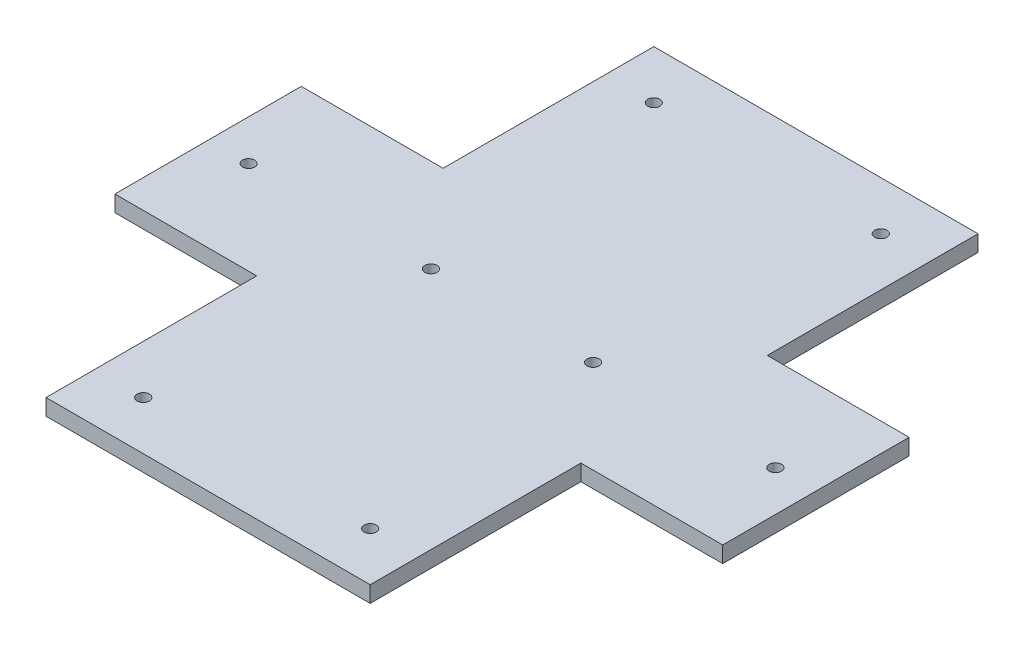
ISO-10303-21;
HEADER;
FILE_DESCRIPTION(('STEP AP214'),'2;1');
FILE_NAME('part.step','',(''),(''),'','','');
FILE_SCHEMA(('AUTOMOTIVE_DESIGN { 1 0 10303 214 1 1 1 1 }'));
ENDSEC;
DATA;
#1=APPLICATION_CONTEXT('core data for automotive mechanical design processes');
#2=APPLICATION_PROTOCOL_DEFINITION('international standard','automotive_design',2000,#1);
#3=PRODUCT_CONTEXT('',#1,'mechanical');
#4=PRODUCT('Part','Part','',(#3));
#5=PRODUCT_RELATED_PRODUCT_CATEGORY('part','',(#4));
#6=PRODUCT_DEFINITION_FORMATION('','',#4);
#7=PRODUCT_DEFINITION_CONTEXT('part definition',#1,'design');
#8=PRODUCT_DEFINITION('design','',#6,#7);
#9=PRODUCT_DEFINITION_SHAPE('','',#8);
#10=(LENGTH_UNIT() NAMED_UNIT(*) SI_UNIT(.MILLI.,.METRE.));
#11=(NAMED_UNIT(*) PLANE_ANGLE_UNIT() SI_UNIT($,.RADIAN.));
#12=(NAMED_UNIT(*) SI_UNIT($,.STERADIAN.) SOLID_ANGLE_UNIT());
#13=UNCERTAINTY_MEASURE_WITH_UNIT(LENGTH_MEASURE(1.E-05),#10,'distance_accuracy_value','');
#14=(GEOMETRIC_REPRESENTATION_CONTEXT(3) GLOBAL_UNCERTAINTY_ASSIGNED_CONTEXT((#13)) GLOBAL_UNIT_ASSIGNED_CONTEXT((#10,
#11,#12)) REPRESENTATION_CONTEXT('',''));
#15=CARTESIAN_POINT('',(0.,0.,0.));
#16=DIRECTION('',(0.,0.,1.));
#17=DIRECTION('',(1.,0.,0.));
#18=AXIS2_PLACEMENT_3D('',#15,#16,#17);
#19=CARTESIAN_POINT('',(0.,4.,0.));
#20=DIRECTION('',(0.,1.,0.));
#21=DIRECTION('',(0.,0.,1.));
#22=AXIS2_PLACEMENT_3D('',#19,#20,#21);
#23=PLANE('',#22);
#24=CARTESIAN_POINT('',(28.,4.,63.));
#25=DIRECTION('',(0.,1.,0.));
#26=DIRECTION('',(0.,0.,1.));
#27=AXIS2_PLACEMENT_3D('',#24,#25,#26);
#28=CIRCLE('',#27,1.5);
#29=CARTESIAN_POINT('',(28.,4.,64.5));
#30=VERTEX_POINT('',#29);
#31=EDGE_CURVE('E352',#30,#30,#28,.T.);
#32=ORIENTED_EDGE('',*,*,#31,.F.);
#33=EDGE_LOOP('',(#32));
#34=FACE_BOUND('',#33,.T.);
#35=CARTESIAN_POINT('',(-28.,4.,-63.));
#36=DIRECTION('',(0.,1.,0.));
#37=DIRECTION('',(0.,0.,1.));
#38=AXIS2_PLACEMENT_3D('',#35,#36,#37);
#39=CIRCLE('',#38,1.5);
#40=CARTESIAN_POINT('',(-28.,4.,-61.5));
#41=VERTEX_POINT('',#40);
#42=EDGE_CURVE('E368',#41,#41,#39,.T.);
#43=ORIENTED_EDGE('',*,*,#42,.F.);
#44=EDGE_LOOP('',(#43));
#45=FACE_BOUND('',#44,.T.);
#46=CARTESIAN_POINT('',(-64.9999999999999,4.,0.));
#47=DIRECTION('',(0.,1.,0.));
#48=DIRECTION('',(0.,0.,-1.));
#49=AXIS2_PLACEMENT_3D('',#46,#47,#48);
#50=CIRCLE('',#49,1.5);
#51=CARTESIAN_POINT('',(-64.9999999999999,4.,-1.5));
#52=VERTEX_POINT('',#51);
#53=EDGE_CURVE('E384',#52,#52,#50,.T.);
#54=ORIENTED_EDGE('',*,*,#53,.F.);
#55=EDGE_LOOP('',(#54));
#56=FACE_BOUND('',#55,.T.);
#57=CARTESIAN_POINT('',(20.,4.,0.));
#58=DIRECTION('',(0.,1.,0.));
#59=DIRECTION('',(0.,0.,1.));
#60=AXIS2_PLACEMENT_3D('',#57,#58,#59);
#61=CIRCLE('',#60,1.5);
#62=CARTESIAN_POINT('',(20.,4.,1.5));
#63=VERTEX_POINT('',#62);
#64=EDGE_CURVE('E174',#63,#63,#61,.T.);
#65=ORIENTED_EDGE('',*,*,#64,.F.);
#66=EDGE_LOOP('',(#65));
#67=FACE_BOUND('',#66,.T.);
#68=DIRECTION('',(-1.,0.,0.));
#69=VECTOR('',#68,1.);
#70=CARTESIAN_POINT('',(40.,4.,-23.));
#71=LINE('',#70,#69);
#72=CARTESIAN_POINT('',(75.,4.,-23.));
#73=VERTEX_POINT('',#72);
#74=CARTESIAN_POINT('',(40.,4.,-23.));
#75=VERTEX_POINT('',#74);
#76=EDGE_CURVE('E204',#73,#75,#71,.T.);
#77=ORIENTED_EDGE('',*,*,#76,.T.);
#78=DIRECTION('',(0.,0.,-1.));
#79=VECTOR('',#78,1.);
#80=CARTESIAN_POINT('',(40.,4.,-23.));
#81=LINE('',#80,#79);
#82=CARTESIAN_POINT('',(40.,4.,-75.));
#83=VERTEX_POINT('',#82);
#84=EDGE_CURVE('E116',#75,#83,#81,.T.);
#85=ORIENTED_EDGE('',*,*,#84,.T.);
#86=DIRECTION('',(-1.,0.,0.));
#87=VECTOR('',#86,1.);
#88=CARTESIAN_POINT('',(-40.,4.,-75.));
#89=LINE('',#88,#87);
#90=CARTESIAN_POINT('',(-40.,4.,-75.));
#91=VERTEX_POINT('',#90);
#92=EDGE_CURVE('E241',#83,#91,#89,.T.);
#93=ORIENTED_EDGE('',*,*,#92,.T.);
#94=DIRECTION('',(0.,0.,1.));
#95=VECTOR('',#94,1.);
#96=CARTESIAN_POINT('',(-40.,4.,-23.));
#97=LINE('',#96,#95);
#98=CARTESIAN_POINT('',(-40.,4.,-23.));
#99=VERTEX_POINT('',#98);
#100=EDGE_CURVE('E261',#91,#99,#97,.T.);
#101=ORIENTED_EDGE('',*,*,#100,.T.);
#102=DIRECTION('',(-1.,0.,0.));
#103=VECTOR('',#102,1.);
#104=CARTESIAN_POINT('',(-75.,4.,-23.));
#105=LINE('',#104,#103);
#106=CARTESIAN_POINT('',(-75.,4.,-23.));
#107=VERTEX_POINT('',#106);
#108=EDGE_CURVE('E257',#99,#107,#105,.T.);
#109=ORIENTED_EDGE('',*,*,#108,.T.);
#110=DIRECTION('',(0.,0.,1.));
#111=VECTOR('',#110,1.);
#112=CARTESIAN_POINT('',(-75.,4.,23.));
#113=LINE('',#112,#111);
#114=CARTESIAN_POINT('',(-75.,4.,23.));
#115=VERTEX_POINT('',#114);
#116=EDGE_CURVE('E260',#107,#115,#113,.T.);
#117=ORIENTED_EDGE('',*,*,#116,.T.);
#118=DIRECTION('',(1.,0.,0.));
#119=VECTOR('',#118,1.);
#120=CARTESIAN_POINT('',(-75.,4.,23.));
#121=LINE('',#120,#119);
#122=CARTESIAN_POINT('',(-40.,4.,23.));
#123=VERTEX_POINT('',#122);
#124=EDGE_CURVE('E265',#115,#123,#121,.T.);
#125=ORIENTED_EDGE('',*,*,#124,.T.);
#126=DIRECTION('',(0.,0.,1.));
#127=VECTOR('',#126,1.);
#128=CARTESIAN_POINT('',(-40.,4.,75.));
#129=LINE('',#128,#127);
#130=CARTESIAN_POINT('',(-40.,4.,75.));
#131=VERTEX_POINT('',#130);
#132=EDGE_CURVE('E272',#123,#131,#129,.T.);
#133=ORIENTED_EDGE('',*,*,#132,.T.);
#134=DIRECTION('',(1.,0.,0.));
#135=VECTOR('',#134,1.);
#136=CARTESIAN_POINT('',(-40.,4.,75.));
#137=LINE('',#136,#135);
#138=CARTESIAN_POINT('',(40.,4.,75.));
#139=VERTEX_POINT('',#138);
#140=EDGE_CURVE('E147',#131,#139,#137,.T.);
#141=ORIENTED_EDGE('',*,*,#140,.T.);
#142=DIRECTION('',(0.,0.,-1.));
#143=VECTOR('',#142,1.);
#144=CARTESIAN_POINT('',(40.,4.,75.));
#145=LINE('',#144,#143);
#146=CARTESIAN_POINT('',(40.,4.,23.));
#147=VERTEX_POINT('',#146);
#148=EDGE_CURVE('E141',#139,#147,#145,.T.);
#149=ORIENTED_EDGE('',*,*,#148,.T.);
#150=DIRECTION('',(1.,0.,0.));
#151=VECTOR('',#150,1.);
#152=CARTESIAN_POINT('',(40.,4.,23.));
#153=LINE('',#152,#151);
#154=CARTESIAN_POINT('',(75.,4.,23.));
#155=VERTEX_POINT('',#154);
#156=EDGE_CURVE('E145',#147,#155,#153,.T.);
#157=ORIENTED_EDGE('',*,*,#156,.T.);
#158=DIRECTION('',(0.,0.,-1.));
#159=VECTOR('',#158,1.);
#160=CARTESIAN_POINT('',(75.,4.,23.));
#161=LINE('',#160,#159);
#162=EDGE_CURVE('E61',#155,#73,#161,.T.);
#163=ORIENTED_EDGE('',*,*,#162,.T.);
#164=EDGE_LOOP('',(#77,#85,#93,#101,#109,#117,#125,#133,#141,#149,#157,#163));
#165=FACE_BOUND('',#164,.T.);
#166=CARTESIAN_POINT('',(65.,4.,0.));
#167=DIRECTION('',(0.,1.,0.));
#168=DIRECTION('',(0.,0.,1.));
#169=AXIS2_PLACEMENT_3D('',#166,#167,#168);
#170=CIRCLE('',#169,1.5);
#171=CARTESIAN_POINT('',(65.,4.,1.5));
#172=VERTEX_POINT('',#171);
#173=EDGE_CURVE('E392',#172,#172,#170,.T.);
#174=ORIENTED_EDGE('',*,*,#173,.F.);
#175=EDGE_LOOP('',(#174));
#176=FACE_BOUND('',#175,.T.);
#177=CARTESIAN_POINT('',(-19.9999999999999,4.,0.));
#178=DIRECTION('',(0.,1.,0.));
#179=DIRECTION('',(0.,0.,-1.));
#180=AXIS2_PLACEMENT_3D('',#177,#178,#179);
#181=CIRCLE('',#180,1.5);
#182=CARTESIAN_POINT('',(-19.9999999999999,4.,-1.5));
#183=VERTEX_POINT('',#182);
#184=EDGE_CURVE('E376',#183,#183,#181,.T.);
#185=ORIENTED_EDGE('',*,*,#184,.F.);
#186=EDGE_LOOP('',(#185));
#187=FACE_BOUND('',#186,.T.);
#188=CARTESIAN_POINT('',(28.,4.,-63.));
#189=DIRECTION('',(0.,1.,0.));
#190=DIRECTION('',(0.,0.,1.));
#191=AXIS2_PLACEMENT_3D('',#188,#189,#190);
#192=CIRCLE('',#191,1.5);
#193=CARTESIAN_POINT('',(28.,4.,-61.5));
#194=VERTEX_POINT('',#193);
#195=EDGE_CURVE('E360',#194,#194,#192,.T.);
#196=ORIENTED_EDGE('',*,*,#195,.F.);
#197=EDGE_LOOP('',(#196));
#198=FACE_BOUND('',#197,.T.);
#199=CARTESIAN_POINT('',(-28.,4.,63.));
#200=DIRECTION('',(0.,1.,0.));
#201=DIRECTION('',(0.,0.,1.));
#202=AXIS2_PLACEMENT_3D('',#199,#200,#201);
#203=CIRCLE('',#202,1.5);
#204=CARTESIAN_POINT('',(-28.,4.,64.5));
#205=VERTEX_POINT('',#204);
#206=EDGE_CURVE('E341',#205,#205,#203,.T.);
#207=ORIENTED_EDGE('',*,*,#206,.F.);
#208=EDGE_LOOP('',(#207));
#209=FACE_BOUND('',#208,.T.);
#210=ADVANCED_FACE('F43',(#34,#45,#56,#67,#165,#176,#187,#198,#209),#23,.T.);
#211=CARTESIAN_POINT('',(0.,0.,0.));
#212=DIRECTION('',(0.,1.,0.));
#213=DIRECTION('',(0.,0.,1.));
#214=AXIS2_PLACEMENT_3D('',#211,#212,#213);
#215=PLANE('',#214);
#216=DIRECTION('',(-1.,0.,0.));
#217=VECTOR('',#216,1.);
#218=CARTESIAN_POINT('',(40.,0.,-23.));
#219=LINE('',#218,#217);
#220=CARTESIAN_POINT('',(75.,0.,-23.));
#221=VERTEX_POINT('',#220);
#222=CARTESIAN_POINT('',(40.,0.,-23.));
#223=VERTEX_POINT('',#222);
#224=EDGE_CURVE('E169',#221,#223,#219,.T.);
#225=ORIENTED_EDGE('',*,*,#224,.F.);
#226=DIRECTION('',(0.,0.,-1.));
#227=VECTOR('',#226,1.);
#228=CARTESIAN_POINT('',(75.,0.,23.));
#229=LINE('',#228,#227);
#230=CARTESIAN_POINT('',(75.,0.,23.));
#231=VERTEX_POINT('',#230);
#232=EDGE_CURVE('E108',#231,#221,#229,.T.);
#233=ORIENTED_EDGE('',*,*,#232,.F.);
#234=DIRECTION('',(1.,0.,0.));
#235=VECTOR('',#234,1.);
#236=CARTESIAN_POINT('',(40.,0.,23.));
#237=LINE('',#236,#235);
#238=CARTESIAN_POINT('',(40.,0.,23.));
#239=VERTEX_POINT('',#238);
#240=EDGE_CURVE('E102',#239,#231,#237,.T.);
#241=ORIENTED_EDGE('',*,*,#240,.F.);
#242=DIRECTION('',(0.,0.,-1.));
#243=VECTOR('',#242,1.);
#244=CARTESIAN_POINT('',(40.,0.,75.));
#245=LINE('',#244,#243);
#246=CARTESIAN_POINT('',(40.,0.,75.));
#247=VERTEX_POINT('',#246);
#248=EDGE_CURVE('E156',#247,#239,#245,.T.);
#249=ORIENTED_EDGE('',*,*,#248,.F.);
#250=DIRECTION('',(1.,0.,0.));
#251=VECTOR('',#250,1.);
#252=CARTESIAN_POINT('',(-40.,0.,75.));
#253=LINE('',#252,#251);
#254=CARTESIAN_POINT('',(-40.,0.,75.));
#255=VERTEX_POINT('',#254);
#256=EDGE_CURVE('E195',#255,#247,#253,.T.);
#257=ORIENTED_EDGE('',*,*,#256,.F.);
#258=DIRECTION('',(0.,0.,1.));
#259=VECTOR('',#258,1.);
#260=CARTESIAN_POINT('',(-40.,0.,75.));
#261=LINE('',#260,#259);
#262=CARTESIAN_POINT('',(-40.,0.,23.));
#263=VERTEX_POINT('',#262);
#264=EDGE_CURVE('E192',#263,#255,#261,.T.);
#265=ORIENTED_EDGE('',*,*,#264,.F.);
#266=DIRECTION('',(1.,0.,0.));
#267=VECTOR('',#266,1.);
#268=CARTESIAN_POINT('',(-75.,0.,23.));
#269=LINE('',#268,#267);
#270=CARTESIAN_POINT('',(-75.,0.,23.));
#271=VERTEX_POINT('',#270);
#272=EDGE_CURVE('E189',#271,#263,#269,.T.);
#273=ORIENTED_EDGE('',*,*,#272,.F.);
#274=DIRECTION('',(0.,0.,1.));
#275=VECTOR('',#274,1.);
#276=CARTESIAN_POINT('',(-75.,0.,23.));
#277=LINE('',#276,#275);
#278=CARTESIAN_POINT('',(-75.,0.,-23.));
#279=VERTEX_POINT('',#278);
#280=EDGE_CURVE('E186',#279,#271,#277,.T.);
#281=ORIENTED_EDGE('',*,*,#280,.F.);
#282=DIRECTION('',(-1.,0.,0.));
#283=VECTOR('',#282,1.);
#284=CARTESIAN_POINT('',(-75.,0.,-23.));
#285=LINE('',#284,#283);
#286=CARTESIAN_POINT('',(-40.,0.,-23.));
#287=VERTEX_POINT('',#286);
#288=EDGE_CURVE('E183',#287,#279,#285,.T.);
#289=ORIENTED_EDGE('',*,*,#288,.F.);
#290=DIRECTION('',(0.,0.,1.));
#291=VECTOR('',#290,1.);
#292=CARTESIAN_POINT('',(-40.,0.,-23.));
#293=LINE('',#292,#291);
#294=CARTESIAN_POINT('',(-40.,0.,-75.));
#295=VERTEX_POINT('',#294);
#296=EDGE_CURVE('E180',#295,#287,#293,.T.);
#297=ORIENTED_EDGE('',*,*,#296,.F.);
#298=DIRECTION('',(-1.,0.,0.));
#299=VECTOR('',#298,1.);
#300=CARTESIAN_POINT('',(-40.,0.,-75.));
#301=LINE('',#300,#299);
#302=CARTESIAN_POINT('',(40.,0.,-75.));
#303=VERTEX_POINT('',#302);
#304=EDGE_CURVE('E177',#303,#295,#301,.T.);
#305=ORIENTED_EDGE('',*,*,#304,.F.);
#306=DIRECTION('',(0.,0.,-1.));
#307=VECTOR('',#306,1.);
#308=CARTESIAN_POINT('',(40.,0.,-23.));
#309=LINE('',#308,#307);
#310=EDGE_CURVE('E173',#223,#303,#309,.T.);
#311=ORIENTED_EDGE('',*,*,#310,.F.);
#312=EDGE_LOOP('',(#225,#233,#241,#249,#257,#265,#273,#281,#289,#297,#305,#311));
#313=FACE_BOUND('',#312,.T.);
#314=CARTESIAN_POINT('',(20.,0.,0.));
#315=DIRECTION('',(0.,1.,0.));
#316=DIRECTION('',(0.,0.,1.));
#317=AXIS2_PLACEMENT_3D('',#314,#315,#316);
#318=CIRCLE('',#317,1.5);
#319=CARTESIAN_POINT('',(20.,0.,1.5));
#320=VERTEX_POINT('',#319);
#321=EDGE_CURVE('E396',#320,#320,#318,.T.);
#322=ORIENTED_EDGE('',*,*,#321,.T.);
#323=EDGE_LOOP('',(#322));
#324=FACE_BOUND('',#323,.T.);
#325=CARTESIAN_POINT('',(65.,0.,0.));
#326=DIRECTION('',(0.,1.,0.));
#327=DIRECTION('',(0.,0.,1.));
#328=AXIS2_PLACEMENT_3D('',#325,#326,#327);
#329=CIRCLE('',#328,1.5);
#330=CARTESIAN_POINT('',(65.,0.,1.5));
#331=VERTEX_POINT('',#330);
#332=EDGE_CURVE('E388',#331,#331,#329,.T.);
#333=ORIENTED_EDGE('',*,*,#332,.T.);
#334=EDGE_LOOP('',(#333));
#335=FACE_BOUND('',#334,.T.);
#336=CARTESIAN_POINT('',(-64.9999999999999,0.,0.));
#337=DIRECTION('',(0.,1.,0.));
#338=DIRECTION('',(0.,0.,-1.));
#339=AXIS2_PLACEMENT_3D('',#336,#337,#338);
#340=CIRCLE('',#339,1.5);
#341=CARTESIAN_POINT('',(-64.9999999999999,0.,-1.5));
#342=VERTEX_POINT('',#341);
#343=EDGE_CURVE('E380',#342,#342,#340,.T.);
#344=ORIENTED_EDGE('',*,*,#343,.T.);
#345=EDGE_LOOP('',(#344));
#346=FACE_BOUND('',#345,.T.);
#347=CARTESIAN_POINT('',(-19.9999999999999,0.,0.));
#348=DIRECTION('',(0.,1.,0.));
#349=DIRECTION('',(0.,0.,-1.));
#350=AXIS2_PLACEMENT_3D('',#347,#348,#349);
#351=CIRCLE('',#350,1.5);
#352=CARTESIAN_POINT('',(-19.9999999999999,0.,-1.5));
#353=VERTEX_POINT('',#352);
#354=EDGE_CURVE('E372',#353,#353,#351,.T.);
#355=ORIENTED_EDGE('',*,*,#354,.T.);
#356=EDGE_LOOP('',(#355));
#357=FACE_BOUND('',#356,.T.);
#358=CARTESIAN_POINT('',(-28.,0.,-63.));
#359=DIRECTION('',(0.,1.,0.));
#360=DIRECTION('',(0.,0.,1.));
#361=AXIS2_PLACEMENT_3D('',#358,#359,#360);
#362=CIRCLE('',#361,1.5);
#363=CARTESIAN_POINT('',(-28.,0.,-61.5));
#364=VERTEX_POINT('',#363);
#365=EDGE_CURVE('E364',#364,#364,#362,.T.);
#366=ORIENTED_EDGE('',*,*,#365,.T.);
#367=EDGE_LOOP('',(#366));
#368=FACE_BOUND('',#367,.T.);
#369=CARTESIAN_POINT('',(28.,0.,-63.));
#370=DIRECTION('',(0.,1.,0.));
#371=DIRECTION('',(0.,0.,1.));
#372=AXIS2_PLACEMENT_3D('',#369,#370,#371);
#373=CIRCLE('',#372,1.5);
#374=CARTESIAN_POINT('',(28.,0.,-61.5));
#375=VERTEX_POINT('',#374);
#376=EDGE_CURVE('E356',#375,#375,#373,.T.);
#377=ORIENTED_EDGE('',*,*,#376,.T.);
#378=EDGE_LOOP('',(#377));
#379=FACE_BOUND('',#378,.T.);
#380=CARTESIAN_POINT('',(28.,0.,63.));
#381=DIRECTION('',(0.,1.,0.));
#382=DIRECTION('',(0.,0.,1.));
#383=AXIS2_PLACEMENT_3D('',#380,#381,#382);
#384=CIRCLE('',#383,1.5);
#385=CARTESIAN_POINT('',(28.,0.,64.5));
#386=VERTEX_POINT('',#385);
#387=EDGE_CURVE('E349',#386,#386,#384,.T.);
#388=ORIENTED_EDGE('',*,*,#387,.T.);
#389=EDGE_LOOP('',(#388));
#390=FACE_BOUND('',#389,.T.);
#391=CARTESIAN_POINT('',(-28.,0.,63.));
#392=DIRECTION('',(0.,1.,0.));
#393=DIRECTION('',(0.,0.,1.));
#394=AXIS2_PLACEMENT_3D('',#391,#392,#393);
#395=CIRCLE('',#394,1.5);
#396=CARTESIAN_POINT('',(-28.,0.,64.5));
#397=VERTEX_POINT('',#396);
#398=EDGE_CURVE('E344',#397,#397,#395,.T.);
#399=ORIENTED_EDGE('',*,*,#398,.T.);
#400=EDGE_LOOP('',(#399));
#401=FACE_BOUND('',#400,.T.);
#402=ADVANCED_FACE('F245',(#313,#324,#335,#346,#357,#368,#379,#390,#401),#215,.F.);
#403=CARTESIAN_POINT('',(40.,4.,-23.));
#404=DIRECTION('',(0.,0.,1.));
#405=DIRECTION('',(1.,0.,0.));
#406=AXIS2_PLACEMENT_3D('',#403,#404,#405);
#407=PLANE('',#406);
#408=ORIENTED_EDGE('',*,*,#224,.T.);
#409=DIRECTION('',(0.,-1.,0.));
#410=VECTOR('',#409,1.);
#411=CARTESIAN_POINT('',(40.,4.,-23.));
#412=LINE('',#411,#410);
#413=EDGE_CURVE('E11',#75,#223,#412,.T.);
#414=ORIENTED_EDGE('',*,*,#413,.F.);
#415=ORIENTED_EDGE('',*,*,#76,.F.);
#416=DIRECTION('',(0.,-1.,0.));
#417=VECTOR('',#416,1.);
#418=CARTESIAN_POINT('',(75.,4.,-23.));
#419=LINE('',#418,#417);
#420=EDGE_CURVE('E165',#73,#221,#419,.T.);
#421=ORIENTED_EDGE('',*,*,#420,.T.);
#422=EDGE_LOOP('',(#408,#414,#415,#421));
#423=FACE_BOUND('',#422,.T.);
#424=ADVANCED_FACE('F45',(#423),#407,.F.);
#425=CARTESIAN_POINT('',(40.,4.,-23.));
#426=DIRECTION('',(-1.,0.,0.));
#427=DIRECTION('',(0.,0.,1.));
#428=AXIS2_PLACEMENT_3D('',#425,#426,#427);
#429=PLANE('',#428);
#430=ORIENTED_EDGE('',*,*,#310,.T.);
#431=DIRECTION('',(0.,-1.,0.));
#432=VECTOR('',#431,1.);
#433=CARTESIAN_POINT('',(40.,4.,-75.));
#434=LINE('',#433,#432);
#435=EDGE_CURVE('E53',#83,#303,#434,.T.);
#436=ORIENTED_EDGE('',*,*,#435,.F.);
#437=ORIENTED_EDGE('',*,*,#84,.F.);
#438=ORIENTED_EDGE('',*,*,#413,.T.);
#439=EDGE_LOOP('',(#430,#436,#437,#438));
#440=FACE_BOUND('',#439,.T.);
#441=ADVANCED_FACE('F558',(#440),#429,.F.);
#442=CARTESIAN_POINT('',(-40.,4.,-75.));
#443=DIRECTION('',(0.,0.,1.));
#444=DIRECTION('',(1.,0.,0.));
#445=AXIS2_PLACEMENT_3D('',#442,#443,#444);
#446=PLANE('',#445);
#447=ORIENTED_EDGE('',*,*,#304,.T.);
#448=DIRECTION('',(0.,-1.,0.));
#449=VECTOR('',#448,1.);
#450=CARTESIAN_POINT('',(-40.,4.,-75.));
#451=LINE('',#450,#449);
#452=EDGE_CURVE('E231',#91,#295,#451,.T.);
#453=ORIENTED_EDGE('',*,*,#452,.F.);
#454=ORIENTED_EDGE('',*,*,#92,.F.);
#455=ORIENTED_EDGE('',*,*,#435,.T.);
#456=EDGE_LOOP('',(#447,#453,#454,#455));
#457=FACE_BOUND('',#456,.T.);
#458=ADVANCED_FACE('F239',(#457),#446,.F.);
#459=CARTESIAN_POINT('',(-40.,4.,-23.));
#460=DIRECTION('',(1.,0.,0.));
#461=DIRECTION('',(0.,0.,-1.));
#462=AXIS2_PLACEMENT_3D('',#459,#460,#461);
#463=PLANE('',#462);
#464=ORIENTED_EDGE('',*,*,#296,.T.);
#465=DIRECTION('',(0.,-1.,0.));
#466=VECTOR('',#465,1.);
#467=CARTESIAN_POINT('',(-40.,4.,-23.));
#468=LINE('',#467,#466);
#469=EDGE_CURVE('E227',#99,#287,#468,.T.);
#470=ORIENTED_EDGE('',*,*,#469,.F.);
#471=ORIENTED_EDGE('',*,*,#100,.F.);
#472=ORIENTED_EDGE('',*,*,#452,.T.);
#473=EDGE_LOOP('',(#464,#470,#471,#472));
#474=FACE_BOUND('',#473,.T.);
#475=ADVANCED_FACE('F251',(#474),#463,.F.);
#476=CARTESIAN_POINT('',(-75.,4.,-23.));
#477=DIRECTION('',(0.,0.,1.));
#478=DIRECTION('',(1.,0.,0.));
#479=AXIS2_PLACEMENT_3D('',#476,#477,#478);
#480=PLANE('',#479);
#481=ORIENTED_EDGE('',*,*,#288,.T.);
#482=DIRECTION('',(0.,-1.,0.));
#483=VECTOR('',#482,1.);
#484=CARTESIAN_POINT('',(-75.,4.,-23.));
#485=LINE('',#484,#483);
#486=EDGE_CURVE('E223',#107,#279,#485,.T.);
#487=ORIENTED_EDGE('',*,*,#486,.F.);
#488=ORIENTED_EDGE('',*,*,#108,.F.);
#489=ORIENTED_EDGE('',*,*,#469,.T.);
#490=EDGE_LOOP('',(#481,#487,#488,#489));
#491=FACE_BOUND('',#490,.T.);
#492=ADVANCED_FACE('F255',(#491),#480,.F.);
#493=CARTESIAN_POINT('',(-75.,4.,23.));
#494=DIRECTION('',(1.,0.,0.));
#495=DIRECTION('',(0.,0.,-1.));
#496=AXIS2_PLACEMENT_3D('',#493,#494,#495);
#497=PLANE('',#496);
#498=ORIENTED_EDGE('',*,*,#280,.T.);
#499=DIRECTION('',(0.,-1.,0.));
#500=VECTOR('',#499,1.);
#501=CARTESIAN_POINT('',(-75.,4.,23.));
#502=LINE('',#501,#500);
#503=EDGE_CURVE('E219',#115,#271,#502,.T.);
#504=ORIENTED_EDGE('',*,*,#503,.F.);
#505=ORIENTED_EDGE('',*,*,#116,.F.);
#506=ORIENTED_EDGE('',*,*,#486,.T.);
#507=EDGE_LOOP('',(#498,#504,#505,#506));
#508=FACE_BOUND('',#507,.T.);
#509=ADVANCED_FACE('F519',(#508),#497,.F.);
#510=CARTESIAN_POINT('',(-75.,4.,23.));
#511=DIRECTION('',(0.,0.,-1.));
#512=DIRECTION('',(-1.,0.,0.));
#513=AXIS2_PLACEMENT_3D('',#510,#511,#512);
#514=PLANE('',#513);
#515=ORIENTED_EDGE('',*,*,#272,.T.);
#516=DIRECTION('',(0.,-1.,0.));
#517=VECTOR('',#516,1.);
#518=CARTESIAN_POINT('',(-40.,4.,23.));
#519=LINE('',#518,#517);
#520=EDGE_CURVE('E215',#123,#263,#519,.T.);
#521=ORIENTED_EDGE('',*,*,#520,.F.);
#522=ORIENTED_EDGE('',*,*,#124,.F.);
#523=ORIENTED_EDGE('',*,*,#503,.T.);
#524=EDGE_LOOP('',(#515,#521,#522,#523));
#525=FACE_BOUND('',#524,.T.);
#526=ADVANCED_FACE('F509',(#525),#514,.F.);
#527=CARTESIAN_POINT('',(-40.,4.,75.));
#528=DIRECTION('',(1.,0.,0.));
#529=DIRECTION('',(0.,0.,-1.));
#530=AXIS2_PLACEMENT_3D('',#527,#528,#529);
#531=PLANE('',#530);
#532=ORIENTED_EDGE('',*,*,#264,.T.);
#533=DIRECTION('',(0.,-1.,0.));
#534=VECTOR('',#533,1.);
#535=CARTESIAN_POINT('',(-40.,4.,75.));
#536=LINE('',#535,#534);
#537=EDGE_CURVE('E211',#131,#255,#536,.T.);
#538=ORIENTED_EDGE('',*,*,#537,.F.);
#539=ORIENTED_EDGE('',*,*,#132,.F.);
#540=ORIENTED_EDGE('',*,*,#520,.T.);
#541=EDGE_LOOP('',(#532,#538,#539,#540));
#542=FACE_BOUND('',#541,.T.);
#543=ADVANCED_FACE('F280',(#542),#531,.F.);
#544=CARTESIAN_POINT('',(-40.,4.,75.));
#545=DIRECTION('',(0.,0.,-1.));
#546=DIRECTION('',(-1.,0.,0.));
#547=AXIS2_PLACEMENT_3D('',#544,#545,#546);
#548=PLANE('',#547);
#549=ORIENTED_EDGE('',*,*,#256,.T.);
#550=DIRECTION('',(0.,-1.,0.));
#551=VECTOR('',#550,1.);
#552=CARTESIAN_POINT('',(40.,4.,75.));
#553=LINE('',#552,#551);
#554=EDGE_CURVE('E158',#139,#247,#553,.T.);
#555=ORIENTED_EDGE('',*,*,#554,.F.);
#556=ORIENTED_EDGE('',*,*,#140,.F.);
#557=ORIENTED_EDGE('',*,*,#537,.T.);
#558=EDGE_LOOP('',(#549,#555,#556,#557));
#559=FACE_BOUND('',#558,.T.);
#560=ADVANCED_FACE('F284',(#559),#548,.F.);
#561=CARTESIAN_POINT('',(40.,4.,75.));
#562=DIRECTION('',(-1.,0.,0.));
#563=DIRECTION('',(0.,0.,1.));
#564=AXIS2_PLACEMENT_3D('',#561,#562,#563);
#565=PLANE('',#564);
#566=ORIENTED_EDGE('',*,*,#248,.T.);
#567=DIRECTION('',(0.,-1.,0.));
#568=VECTOR('',#567,1.);
#569=CARTESIAN_POINT('',(40.,4.,23.));
#570=LINE('',#569,#568);
#571=EDGE_CURVE('E153',#147,#239,#570,.T.);
#572=ORIENTED_EDGE('',*,*,#571,.F.);
#573=ORIENTED_EDGE('',*,*,#148,.F.);
#574=ORIENTED_EDGE('',*,*,#554,.T.);
#575=EDGE_LOOP('',(#566,#572,#573,#574));
#576=FACE_BOUND('',#575,.T.);
#577=ADVANCED_FACE('F154',(#576),#565,.F.);
#578=CARTESIAN_POINT('',(40.,4.,23.));
#579=DIRECTION('',(0.,0.,-1.));
#580=DIRECTION('',(-1.,0.,0.));
#581=AXIS2_PLACEMENT_3D('',#578,#579,#580);
#582=PLANE('',#581);
#583=ORIENTED_EDGE('',*,*,#240,.T.);
#584=DIRECTION('',(0.,-1.,0.));
#585=VECTOR('',#584,1.);
#586=CARTESIAN_POINT('',(75.,4.,23.));
#587=LINE('',#586,#585);
#588=EDGE_CURVE('E159',#155,#231,#587,.T.);
#589=ORIENTED_EDGE('',*,*,#588,.F.);
#590=ORIENTED_EDGE('',*,*,#156,.F.);
#591=ORIENTED_EDGE('',*,*,#571,.T.);
#592=EDGE_LOOP('',(#583,#589,#590,#591));
#593=FACE_BOUND('',#592,.T.);
#594=ADVANCED_FACE('F161',(#593),#582,.F.);
#595=CARTESIAN_POINT('',(75.,4.,23.));
#596=DIRECTION('',(-1.,0.,0.));
#597=DIRECTION('',(0.,0.,1.));
#598=AXIS2_PLACEMENT_3D('',#595,#596,#597);
#599=PLANE('',#598);
#600=ORIENTED_EDGE('',*,*,#232,.T.);
#601=ORIENTED_EDGE('',*,*,#420,.F.);
#602=ORIENTED_EDGE('',*,*,#162,.F.);
#603=ORIENTED_EDGE('',*,*,#588,.T.);
#604=EDGE_LOOP('',(#600,#601,#602,#603));
#605=FACE_BOUND('',#604,.T.);
#606=ADVANCED_FACE('F288',(#605),#599,.F.);
#607=CARTESIAN_POINT('',(20.,4.,0.));
#608=DIRECTION('',(0.,-1.,0.));
#609=DIRECTION('',(0.,0.,-1.));
#610=AXIS2_PLACEMENT_3D('',#607,#608,#609);
#611=CYLINDRICAL_SURFACE('',#610,1.5);
#612=ORIENTED_EDGE('',*,*,#64,.T.);
#613=EDGE_LOOP('',(#612));
#614=FACE_BOUND('',#613,.T.);
#615=ORIENTED_EDGE('',*,*,#321,.F.);
#616=EDGE_LOOP('',(#615));
#617=FACE_BOUND('',#616,.T.);
#618=ADVANCED_FACE('F290',(#614,#617),#611,.F.);
#619=CARTESIAN_POINT('',(65.,4.,0.));
#620=DIRECTION('',(0.,-1.,0.));
#621=DIRECTION('',(0.,0.,-1.));
#622=AXIS2_PLACEMENT_3D('',#619,#620,#621);
#623=CYLINDRICAL_SURFACE('',#622,1.5);
#624=ORIENTED_EDGE('',*,*,#173,.T.);
#625=EDGE_LOOP('',(#624));
#626=FACE_BOUND('',#625,.T.);
#627=ORIENTED_EDGE('',*,*,#332,.F.);
#628=EDGE_LOOP('',(#627));
#629=FACE_BOUND('',#628,.T.);
#630=ADVANCED_FACE('F296',(#626,#629),#623,.F.);
#631=CARTESIAN_POINT('',(-64.9999999999999,4.,0.));
#632=DIRECTION('',(0.,-1.,0.));
#633=DIRECTION('',(0.,0.,-1.));
#634=AXIS2_PLACEMENT_3D('',#631,#632,#633);
#635=CYLINDRICAL_SURFACE('',#634,1.5);
#636=ORIENTED_EDGE('',*,*,#53,.T.);
#637=EDGE_LOOP('',(#636));
#638=FACE_BOUND('',#637,.T.);
#639=ORIENTED_EDGE('',*,*,#343,.F.);
#640=EDGE_LOOP('',(#639));
#641=FACE_BOUND('',#640,.T.);
#642=ADVANCED_FACE('F312',(#638,#641),#635,.F.);
#643=CARTESIAN_POINT('',(-19.9999999999999,4.,0.));
#644=DIRECTION('',(0.,-1.,0.));
#645=DIRECTION('',(0.,0.,-1.));
#646=AXIS2_PLACEMENT_3D('',#643,#644,#645);
#647=CYLINDRICAL_SURFACE('',#646,1.5);
#648=ORIENTED_EDGE('',*,*,#184,.T.);
#649=EDGE_LOOP('',(#648));
#650=FACE_BOUND('',#649,.T.);
#651=ORIENTED_EDGE('',*,*,#354,.F.);
#652=EDGE_LOOP('',(#651));
#653=FACE_BOUND('',#652,.T.);
#654=ADVANCED_FACE('F316',(#650,#653),#647,.F.);
#655=CARTESIAN_POINT('',(-28.,4.,-63.));
#656=DIRECTION('',(0.,-1.,0.));
#657=DIRECTION('',(0.,0.,-1.));
#658=AXIS2_PLACEMENT_3D('',#655,#656,#657);
#659=CYLINDRICAL_SURFACE('',#658,1.5);
#660=ORIENTED_EDGE('',*,*,#42,.T.);
#661=EDGE_LOOP('',(#660));
#662=FACE_BOUND('',#661,.T.);
#663=ORIENTED_EDGE('',*,*,#365,.F.);
#664=EDGE_LOOP('',(#663));
#665=FACE_BOUND('',#664,.T.);
#666=ADVANCED_FACE('F320',(#662,#665),#659,.F.);
#667=CARTESIAN_POINT('',(28.,4.,-63.));
#668=DIRECTION('',(0.,-1.,0.));
#669=DIRECTION('',(0.,0.,-1.));
#670=AXIS2_PLACEMENT_3D('',#667,#668,#669);
#671=CYLINDRICAL_SURFACE('',#670,1.5);
#672=ORIENTED_EDGE('',*,*,#195,.T.);
#673=EDGE_LOOP('',(#672));
#674=FACE_BOUND('',#673,.T.);
#675=ORIENTED_EDGE('',*,*,#376,.F.);
#676=EDGE_LOOP('',(#675));
#677=FACE_BOUND('',#676,.T.);
#678=ADVANCED_FACE('F324',(#674,#677),#671,.F.);
#679=CARTESIAN_POINT('',(28.,4.,63.));
#680=DIRECTION('',(0.,-1.,0.));
#681=DIRECTION('',(0.,0.,-1.));
#682=AXIS2_PLACEMENT_3D('',#679,#680,#681);
#683=CYLINDRICAL_SURFACE('',#682,1.5);
#684=ORIENTED_EDGE('',*,*,#31,.T.);
#685=EDGE_LOOP('',(#684));
#686=FACE_BOUND('',#685,.T.);
#687=ORIENTED_EDGE('',*,*,#387,.F.);
#688=EDGE_LOOP('',(#687));
#689=FACE_BOUND('',#688,.T.);
#690=ADVANCED_FACE('F328',(#686,#689),#683,.F.);
#691=CARTESIAN_POINT('',(-28.,4.,63.));
#692=DIRECTION('',(0.,-1.,0.));
#693=DIRECTION('',(0.,0.,-1.));
#694=AXIS2_PLACEMENT_3D('',#691,#692,#693);
#695=CYLINDRICAL_SURFACE('',#694,1.5);
#696=ORIENTED_EDGE('',*,*,#206,.T.);
#697=EDGE_LOOP('',(#696));
#698=FACE_BOUND('',#697,.T.);
#699=ORIENTED_EDGE('',*,*,#398,.F.);
#700=EDGE_LOOP('',(#699));
#701=FACE_BOUND('',#700,.T.);
#702=ADVANCED_FACE('F332',(#698,#701),#695,.F.);
#703=CLOSED_SHELL('',(#210,#402,#424,#441,#458,#475,#492,#509,#526,#543,#560,#577,#594,#606,
#618,#630,#642,#654,#666,#678,#690,#702));
#704=MANIFOLD_SOLID_BREP('B2',#703);
#705=ADVANCED_BREP_SHAPE_REPRESENTATION('',(#18,#704),#14);
#706=SHAPE_DEFINITION_REPRESENTATION(#9,#705);
ENDSEC;
END-ISO-10303-21;
